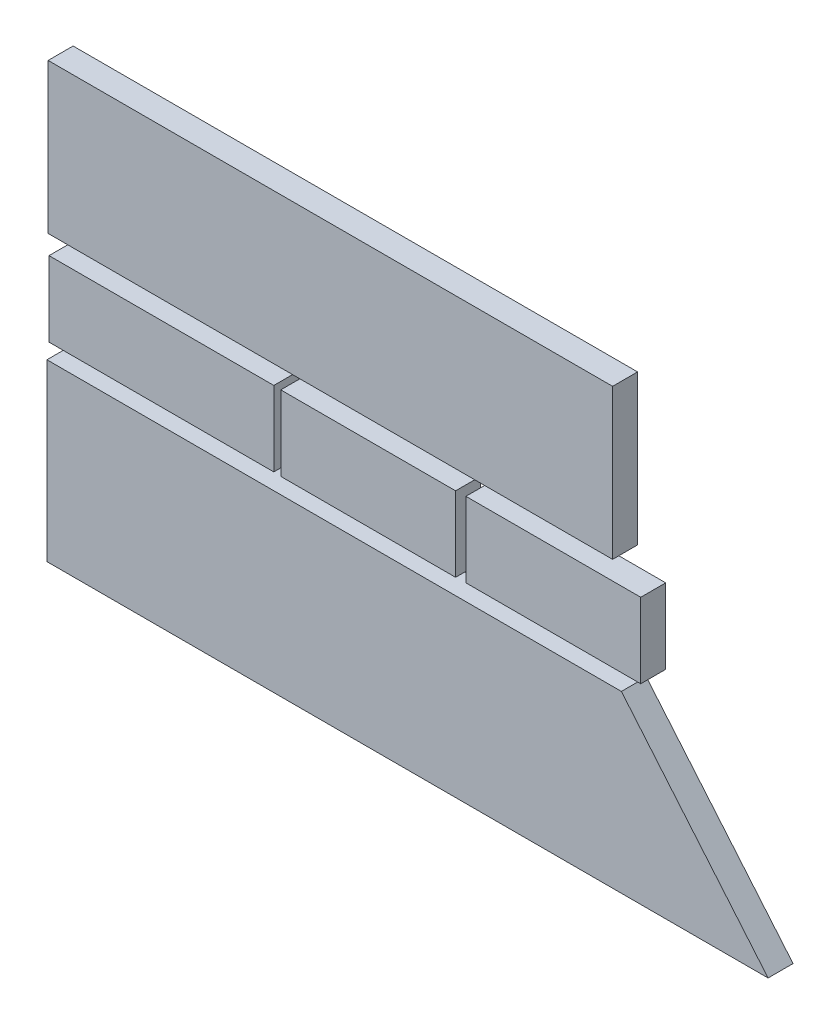
ISO-10303-21;
HEADER;
FILE_DESCRIPTION(('STEP AP214'),'2;1');
FILE_NAME('part.step','',(''),(''),'','','');
FILE_SCHEMA(('AUTOMOTIVE_DESIGN { 1 0 10303 214 1 1 1 1 }'));
ENDSEC;
DATA;
#1=APPLICATION_CONTEXT('core data for automotive mechanical design processes');
#2=APPLICATION_PROTOCOL_DEFINITION('international standard','automotive_design',2000,#1);
#3=PRODUCT_CONTEXT('',#1,'mechanical');
#4=PRODUCT('Part','Part','',(#3));
#5=PRODUCT_RELATED_PRODUCT_CATEGORY('part','',(#4));
#6=PRODUCT_DEFINITION_FORMATION('','',#4);
#7=PRODUCT_DEFINITION_CONTEXT('part definition',#1,'design');
#8=PRODUCT_DEFINITION('design','',#6,#7);
#9=PRODUCT_DEFINITION_SHAPE('','',#8);
#10=(LENGTH_UNIT() NAMED_UNIT(*) SI_UNIT(.MILLI.,.METRE.));
#11=(NAMED_UNIT(*) PLANE_ANGLE_UNIT() SI_UNIT($,.RADIAN.));
#12=(NAMED_UNIT(*) SI_UNIT($,.STERADIAN.) SOLID_ANGLE_UNIT());
#13=UNCERTAINTY_MEASURE_WITH_UNIT(LENGTH_MEASURE(1.E-05),#10,'distance_accuracy_value','');
#14=(GEOMETRIC_REPRESENTATION_CONTEXT(3) GLOBAL_UNCERTAINTY_ASSIGNED_CONTEXT((#13)) GLOBAL_UNIT_ASSIGNED_CONTEXT((#10,
#11,#12)) REPRESENTATION_CONTEXT('',''));
#15=CARTESIAN_POINT('',(0.,0.,0.));
#16=DIRECTION('',(0.,0.,1.));
#17=DIRECTION('',(1.,0.,0.));
#18=AXIS2_PLACEMENT_3D('',#15,#16,#17);
#19=CARTESIAN_POINT('',(62.189349991883,23.5474855230684,60.1976823489891));
#20=DIRECTION('',(0.,-1.,0.));
#21=DIRECTION('',(0.,0.,-1.));
#22=AXIS2_PLACEMENT_3D('',#19,#20,#21);
#23=PLANE('',#22);
#24=DIRECTION('',(-1.,0.,0.));
#25=VECTOR('',#24,1.);
#26=CARTESIAN_POINT('',(62.1893499918829,23.5474855230684,50.1976823489891));
#27=LINE('',#26,#25);
#28=CARTESIAN_POINT('',(62.1893499918829,23.5474855230684,50.1976823489891));
#29=VERTEX_POINT('',#28);
#30=CARTESIAN_POINT('',(-7.81065000811707,23.5474855230684,50.1976823489896));
#31=VERTEX_POINT('',#30);
#32=EDGE_CURVE('P0_E101',#29,#31,#27,.T.);
#33=ORIENTED_EDGE('',*,*,#32,.F.);
#34=DIRECTION('',(0.,0.,-1.));
#35=VECTOR('',#34,1.);
#36=CARTESIAN_POINT('',(62.189349991883,23.5474855230684,60.1976823489891));
#37=LINE('',#36,#35);
#38=CARTESIAN_POINT('',(62.189349991883,23.5474855230684,60.1976823489891));
#39=VERTEX_POINT('',#38);
#40=EDGE_CURVE('P0_E11',#39,#29,#37,.T.);
#41=ORIENTED_EDGE('',*,*,#40,.F.);
#42=DIRECTION('',(-1.,0.,0.));
#43=VECTOR('',#42,1.);
#44=CARTESIAN_POINT('',(62.189349991883,23.5474855230684,60.1976823489891));
#45=LINE('',#44,#43);
#46=CARTESIAN_POINT('',(-7.810650008117,23.5474855230684,60.1976823489896));
#47=VERTEX_POINT('',#46);
#48=EDGE_CURVE('P0_E95',#39,#47,#45,.T.);
#49=ORIENTED_EDGE('',*,*,#48,.T.);
#50=DIRECTION('',(0.,0.,-1.));
#51=VECTOR('',#50,1.);
#52=CARTESIAN_POINT('',(-7.810650008117,23.5474855230684,60.1976823489896));
#53=LINE('',#52,#51);
#54=EDGE_CURVE('P0_E40',#47,#31,#53,.T.);
#55=ORIENTED_EDGE('',*,*,#54,.T.);
#56=EDGE_LOOP('',(#33,#41,#49,#55));
#57=FACE_BOUND('',#56,.T.);
#58=ADVANCED_FACE('P0_F37',(#57),#23,.T.);
#59=CARTESIAN_POINT('',(62.189349991883,53.5474855230684,60.197682348989));
#60=DIRECTION('',(1.,0.,0.));
#61=DIRECTION('',(0.,0.,-1.));
#62=AXIS2_PLACEMENT_3D('',#59,#60,#61);
#63=PLANE('',#62);
#64=DIRECTION('',(0.,-1.,0.));
#65=VECTOR('',#64,1.);
#66=CARTESIAN_POINT('',(62.1893499918829,53.5474855230684,50.197682348989));
#67=LINE('',#66,#65);
#68=CARTESIAN_POINT('',(62.1893499918829,53.5474855230684,50.197682348989));
#69=VERTEX_POINT('',#68);
#70=EDGE_CURVE('P0_E97',#69,#29,#67,.T.);
#71=ORIENTED_EDGE('',*,*,#70,.F.);
#72=DIRECTION('',(0.,0.,-1.));
#73=VECTOR('',#72,1.);
#74=CARTESIAN_POINT('',(62.189349991883,53.5474855230684,60.197682348989));
#75=LINE('',#74,#73);
#76=CARTESIAN_POINT('',(62.189349991883,53.5474855230684,60.197682348989));
#77=VERTEX_POINT('',#76);
#78=EDGE_CURVE('P0_E46',#77,#69,#75,.T.);
#79=ORIENTED_EDGE('',*,*,#78,.F.);
#80=DIRECTION('',(0.,-1.,0.));
#81=VECTOR('',#80,1.);
#82=CARTESIAN_POINT('',(62.189349991883,53.5474855230684,60.197682348989));
#83=LINE('',#82,#81);
#84=EDGE_CURVE('P0_E92',#77,#39,#83,.T.);
#85=ORIENTED_EDGE('',*,*,#84,.T.);
#86=ORIENTED_EDGE('',*,*,#40,.T.);
#87=EDGE_LOOP('',(#71,#79,#85,#86));
#88=FACE_BOUND('',#87,.T.);
#89=ADVANCED_FACE('P0_F111',(#88),#63,.T.);
#90=CARTESIAN_POINT('',(-7.810650008117,53.5474855230684,60.1976823489895));
#91=DIRECTION('',(0.,1.,0.));
#92=DIRECTION('',(0.,0.,1.));
#93=AXIS2_PLACEMENT_3D('',#90,#91,#92);
#94=PLANE('',#93);
#95=DIRECTION('',(1.,0.,0.));
#96=VECTOR('',#95,1.);
#97=CARTESIAN_POINT('',(-7.81065000811707,53.5474855230684,50.1976823489895));
#98=LINE('',#97,#96);
#99=CARTESIAN_POINT('',(-7.81065000811707,53.5474855230684,50.1976823489895));
#100=VERTEX_POINT('',#99);
#101=EDGE_CURVE('P0_E87',#100,#69,#98,.T.);
#102=ORIENTED_EDGE('',*,*,#101,.F.);
#103=DIRECTION('',(0.,0.,-1.));
#104=VECTOR('',#103,1.);
#105=CARTESIAN_POINT('',(-7.810650008117,53.5474855230684,60.1976823489895));
#106=LINE('',#105,#104);
#107=CARTESIAN_POINT('',(-7.810650008117,53.5474855230684,60.1976823489895));
#108=VERTEX_POINT('',#107);
#109=EDGE_CURVE('P0_E82',#108,#100,#106,.T.);
#110=ORIENTED_EDGE('',*,*,#109,.F.);
#111=DIRECTION('',(1.,0.,0.));
#112=VECTOR('',#111,1.);
#113=CARTESIAN_POINT('',(-7.810650008117,53.5474855230684,60.1976823489895));
#114=LINE('',#113,#112);
#115=EDGE_CURVE('P0_E85',#108,#77,#114,.T.);
#116=ORIENTED_EDGE('',*,*,#115,.T.);
#117=ORIENTED_EDGE('',*,*,#78,.T.);
#118=EDGE_LOOP('',(#102,#110,#116,#117));
#119=FACE_BOUND('',#118,.T.);
#120=ADVANCED_FACE('P0_F84',(#119),#94,.T.);
#121=CARTESIAN_POINT('',(-7.810650008117,23.5474855230684,60.1976823489896));
#122=DIRECTION('',(-1.,0.,0.));
#123=DIRECTION('',(0.,0.,1.));
#124=AXIS2_PLACEMENT_3D('',#121,#122,#123);
#125=PLANE('',#124);
#126=DIRECTION('',(0.,1.,0.));
#127=VECTOR('',#126,1.);
#128=CARTESIAN_POINT('',(-7.81065000811707,23.5474855230684,50.1976823489896));
#129=LINE('',#128,#127);
#130=EDGE_CURVE('P0_E104',#31,#100,#129,.T.);
#131=ORIENTED_EDGE('',*,*,#130,.F.);
#132=ORIENTED_EDGE('',*,*,#54,.F.);
#133=DIRECTION('',(0.,1.,0.));
#134=VECTOR('',#133,1.);
#135=CARTESIAN_POINT('',(-7.810650008117,23.5474855230684,60.1976823489896));
#136=LINE('',#135,#134);
#137=EDGE_CURVE('P0_E91',#47,#108,#136,.T.);
#138=ORIENTED_EDGE('',*,*,#137,.T.);
#139=ORIENTED_EDGE('',*,*,#109,.T.);
#140=EDGE_LOOP('',(#131,#132,#138,#139));
#141=FACE_BOUND('',#140,.T.);
#142=ADVANCED_FACE('P0_F94',(#141),#125,.T.);
#143=CARTESIAN_POINT('',(4.18121664714982E-13,2.09060832357491E-13,60.1976823489896));
#144=DIRECTION('',(0.,0.,-1.));
#145=DIRECTION('',(-1.,0.,0.));
#146=AXIS2_PLACEMENT_3D('',#143,#144,#145);
#147=PLANE('',#146);
#148=ORIENTED_EDGE('',*,*,#48,.F.);
#149=ORIENTED_EDGE('',*,*,#84,.F.);
#150=ORIENTED_EDGE('',*,*,#115,.F.);
#151=ORIENTED_EDGE('',*,*,#137,.F.);
#152=EDGE_LOOP('',(#148,#149,#150,#151));
#153=FACE_BOUND('',#152,.T.);
#154=ADVANCED_FACE('P0_F90',(#153),#147,.F.);
#155=CARTESIAN_POINT('',(3.48316392041676E-13,1.74158196020838E-13,50.1976823489896));
#156=DIRECTION('',(0.,0.,-1.));
#157=DIRECTION('',(-1.,0.,0.));
#158=AXIS2_PLACEMENT_3D('',#155,#156,#157);
#159=PLANE('',#158);
#160=ORIENTED_EDGE('',*,*,#32,.T.);
#161=ORIENTED_EDGE('',*,*,#130,.T.);
#162=ORIENTED_EDGE('',*,*,#101,.T.);
#163=ORIENTED_EDGE('',*,*,#70,.T.);
#164=EDGE_LOOP('',(#160,#161,#162,#163));
#165=FACE_BOUND('',#164,.T.);
#166=ADVANCED_FACE('P0_F110',(#165),#159,.T.);
#167=CLOSED_SHELL('',(#58,#89,#120,#142,#154,#166));
#168=MANIFOLD_SOLID_BREP('P0_B2',#167);
#169=CARTESIAN_POINT('',(-101.426864066596,17.1790575138035,60.1976823480801));
#170=DIRECTION('',(0.,-1.,0.));
#171=DIRECTION('',(1.,0.,0.));
#172=AXIS2_PLACEMENT_3D('',#169,#170,#171);
#173=PLANE('',#172);
#174=DIRECTION('',(-1.,0.,0.));
#175=VECTOR('',#174,1.);
#176=CARTESIAN_POINT('',(-101.426864066596,17.1790575138035,50.1976823480801));
#177=LINE('',#176,#175);
#178=CARTESIAN_POINT('',(128.573135933404,17.1790575138035,50.1976823480801));
#179=VERTEX_POINT('',#178);
#180=CARTESIAN_POINT('',(-101.426864066596,17.1790575138035,50.1976823480801));
#181=VERTEX_POINT('',#180);
#182=EDGE_CURVE('P1_E88',#179,#181,#177,.T.);
#183=ORIENTED_EDGE('',*,*,#182,.T.);
#184=DIRECTION('',(0.,0.,-1.));
#185=VECTOR('',#184,1.);
#186=CARTESIAN_POINT('',(-101.426864066596,17.1790575138035,60.1976823480801));
#187=LINE('',#186,#185);
#188=CARTESIAN_POINT('',(-101.426864066596,17.1790575138035,60.1976823480801));
#189=VERTEX_POINT('',#188);
#190=EDGE_CURVE('P1_E12',#189,#181,#187,.T.);
#191=ORIENTED_EDGE('',*,*,#190,.F.);
#192=DIRECTION('',(-1.,0.,0.));
#193=VECTOR('',#192,1.);
#194=CARTESIAN_POINT('',(-101.426864066596,17.1790575138035,60.1976823480801));
#195=LINE('',#194,#193);
#196=CARTESIAN_POINT('',(128.573135933404,17.1790575138035,60.1976823480801));
#197=VERTEX_POINT('',#196);
#198=EDGE_CURVE('P1_E71',#197,#189,#195,.T.);
#199=ORIENTED_EDGE('',*,*,#198,.F.);
#200=DIRECTION('',(0.,0.,-1.));
#201=VECTOR('',#200,1.);
#202=CARTESIAN_POINT('',(128.573135933404,17.1790575138035,60.1976823480801));
#203=LINE('',#202,#201);
#204=EDGE_CURVE('P1_E85',#197,#179,#203,.T.);
#205=ORIENTED_EDGE('',*,*,#204,.T.);
#206=EDGE_LOOP('',(#183,#191,#199,#205));
#207=FACE_BOUND('',#206,.T.);
#208=ADVANCED_FACE('P1_F20',(#207),#173,.F.);
#209=CARTESIAN_POINT('',(-101.426864066596,-52.8209424861966,60.1976823480799));
#210=DIRECTION('',(1.,0.,0.));
#211=DIRECTION('',(0.,1.,0.));
#212=AXIS2_PLACEMENT_3D('',#209,#210,#211);
#213=PLANE('',#212);
#214=DIRECTION('',(0.,-1.,0.));
#215=VECTOR('',#214,1.);
#216=CARTESIAN_POINT('',(-101.426864066596,-52.8209424861965,50.1976823480799));
#217=LINE('',#216,#215);
#218=CARTESIAN_POINT('',(-101.426864066596,-52.8209424861965,50.1976823480799));
#219=VERTEX_POINT('',#218);
#220=EDGE_CURVE('P1_E77',#181,#219,#217,.T.);
#221=ORIENTED_EDGE('',*,*,#220,.T.);
#222=DIRECTION('',(0.,0.,-1.));
#223=VECTOR('',#222,1.);
#224=CARTESIAN_POINT('',(-101.426864066596,-52.8209424861966,60.1976823480799));
#225=LINE('',#224,#223);
#226=CARTESIAN_POINT('',(-101.426864066596,-52.8209424861966,60.1976823480799));
#227=VERTEX_POINT('',#226);
#228=EDGE_CURVE('P1_E29',#227,#219,#225,.T.);
#229=ORIENTED_EDGE('',*,*,#228,.F.);
#230=DIRECTION('',(0.,-1.,0.));
#231=VECTOR('',#230,1.);
#232=CARTESIAN_POINT('',(-101.426864066596,-52.8209424861966,60.1976823480799));
#233=LINE('',#232,#231);
#234=EDGE_CURVE('P1_E66',#189,#227,#233,.T.);
#235=ORIENTED_EDGE('',*,*,#234,.F.);
#236=ORIENTED_EDGE('',*,*,#190,.T.);
#237=EDGE_LOOP('',(#221,#229,#235,#236));
#238=FACE_BOUND('',#237,.T.);
#239=ADVANCED_FACE('P1_F76',(#238),#213,.F.);
#240=CARTESIAN_POINT('',(187.310110115814,-52.8209424861966,60.1976823480799));
#241=DIRECTION('',(0.,1.,0.));
#242=DIRECTION('',(-1.,0.,0.));
#243=AXIS2_PLACEMENT_3D('',#240,#241,#242);
#244=PLANE('',#243);
#245=DIRECTION('',(1.,0.,0.));
#246=VECTOR('',#245,1.);
#247=CARTESIAN_POINT('',(187.310110115814,-52.8209424861965,50.1976823480799));
#248=LINE('',#247,#246);
#249=CARTESIAN_POINT('',(187.310110115814,-52.8209424861965,50.1976823480799));
#250=VERTEX_POINT('',#249);
#251=EDGE_CURVE('P1_E53',#219,#250,#248,.T.);
#252=ORIENTED_EDGE('',*,*,#251,.T.);
#253=DIRECTION('',(0.,0.,-1.));
#254=VECTOR('',#253,1.);
#255=CARTESIAN_POINT('',(187.310110115814,-52.8209424861966,60.1976823480799));
#256=LINE('',#255,#254);
#257=CARTESIAN_POINT('',(187.310110115814,-52.8209424861966,60.1976823480799));
#258=VERTEX_POINT('',#257);
#259=EDGE_CURVE('P1_E79',#258,#250,#256,.T.);
#260=ORIENTED_EDGE('',*,*,#259,.F.);
#261=DIRECTION('',(1.,0.,0.));
#262=VECTOR('',#261,1.);
#263=CARTESIAN_POINT('',(-101.426864066596,-52.8209424861966,60.1976823480799));
#264=LINE('',#263,#262);
#265=EDGE_CURVE('P1_E69',#227,#258,#264,.T.);
#266=ORIENTED_EDGE('',*,*,#265,.F.);
#267=ORIENTED_EDGE('',*,*,#228,.T.);
#268=EDGE_LOOP('',(#252,#260,#266,#267));
#269=FACE_BOUND('',#268,.T.);
#270=ADVANCED_FACE('P1_F80',(#269),#244,.F.);
#271=CARTESIAN_POINT('',(128.573135933404,17.1790575138035,60.1976823480801));
#272=DIRECTION('',(-0.766044443118974,-0.642787609686544,0.));
#273=DIRECTION('',(0.642787609686544,-0.766044443118974,0.));
#274=AXIS2_PLACEMENT_3D('',#271,#272,#273);
#275=PLANE('',#274);
#276=DIRECTION('',(-0.642787609686544,0.766044443118974,0.));
#277=VECTOR('',#276,1.);
#278=CARTESIAN_POINT('',(128.573135933404,17.1790575138035,50.1976823480801));
#279=LINE('',#278,#277);
#280=EDGE_CURVE('P1_E59',#250,#179,#279,.T.);
#281=ORIENTED_EDGE('',*,*,#280,.T.);
#282=ORIENTED_EDGE('',*,*,#204,.F.);
#283=DIRECTION('',(-0.642787609686544,0.766044443118974,0.));
#284=VECTOR('',#283,1.);
#285=CARTESIAN_POINT('',(128.573135933404,17.1790575138035,60.1976823480801));
#286=LINE('',#285,#284);
#287=EDGE_CURVE('P1_E37',#258,#197,#286,.T.);
#288=ORIENTED_EDGE('',*,*,#287,.F.);
#289=ORIENTED_EDGE('',*,*,#259,.T.);
#290=EDGE_LOOP('',(#281,#282,#288,#289));
#291=FACE_BOUND('',#290,.T.);
#292=ADVANCED_FACE('P1_F107',(#291),#275,.F.);
#293=CARTESIAN_POINT('',(13.5731359334039,-17.8209424861966,60.19768234808));
#294=DIRECTION('',(0.,0.,1.));
#295=DIRECTION('',(0.,-1.,0.));
#296=AXIS2_PLACEMENT_3D('',#293,#294,#295);
#297=PLANE('',#296);
#298=ORIENTED_EDGE('',*,*,#198,.T.);
#299=ORIENTED_EDGE('',*,*,#234,.T.);
#300=ORIENTED_EDGE('',*,*,#265,.T.);
#301=ORIENTED_EDGE('',*,*,#287,.T.);
#302=EDGE_LOOP('',(#298,#299,#300,#301));
#303=FACE_BOUND('',#302,.T.);
#304=ADVANCED_FACE('P1_F67',(#303),#297,.T.);
#305=CARTESIAN_POINT('',(13.5731359334039,-17.8209424861965,50.19768234808));
#306=DIRECTION('',(0.,0.,1.));
#307=DIRECTION('',(0.,-1.,0.));
#308=AXIS2_PLACEMENT_3D('',#305,#306,#307);
#309=PLANE('',#308);
#310=ORIENTED_EDGE('',*,*,#182,.F.);
#311=ORIENTED_EDGE('',*,*,#280,.F.);
#312=ORIENTED_EDGE('',*,*,#251,.F.);
#313=ORIENTED_EDGE('',*,*,#220,.F.);
#314=EDGE_LOOP('',(#310,#311,#312,#313));
#315=FACE_BOUND('',#314,.T.);
#316=ADVANCED_FACE('P1_F110',(#315),#309,.F.);
#317=CLOSED_SHELL('',(#208,#239,#270,#292,#304,#316));
#318=MANIFOLD_SOLID_BREP('P1_B1',#317);
#319=CARTESIAN_POINT('',(136.3176936753,23.7019195724088,60.1976823480799));
#320=DIRECTION('',(-1.,0.,0.));
#321=DIRECTION('',(0.,-1.,0.));
#322=AXIS2_PLACEMENT_3D('',#319,#320,#321);
#323=PLANE('',#322);
#324=DIRECTION('',(0.,1.,0.));
#325=VECTOR('',#324,1.);
#326=CARTESIAN_POINT('',(136.3176936753,23.7019195724088,50.1976823480799));
#327=LINE('',#326,#325);
#328=CARTESIAN_POINT('',(136.3176936753,23.7019195724088,50.1976823480799));
#329=VERTEX_POINT('',#328);
#330=CARTESIAN_POINT('',(136.3176936753,53.7019195724088,50.19768234808));
#331=VERTEX_POINT('',#330);
#332=EDGE_CURVE('P2_E87',#329,#331,#327,.T.);
#333=ORIENTED_EDGE('',*,*,#332,.T.);
#334=DIRECTION('',(0.,0.,-1.));
#335=VECTOR('',#334,1.);
#336=CARTESIAN_POINT('',(136.3176936753,53.7019195724088,60.19768234808));
#337=LINE('',#336,#335);
#338=CARTESIAN_POINT('',(136.3176936753,53.7019195724088,60.19768234808));
#339=VERTEX_POINT('',#338);
#340=EDGE_CURVE('P2_E11',#339,#331,#337,.T.);
#341=ORIENTED_EDGE('',*,*,#340,.F.);
#342=DIRECTION('',(0.,1.,0.));
#343=VECTOR('',#342,1.);
#344=CARTESIAN_POINT('',(136.3176936753,23.7019195724088,60.1976823480799));
#345=LINE('',#344,#343);
#346=CARTESIAN_POINT('',(136.3176936753,23.7019195724088,60.1976823480799));
#347=VERTEX_POINT('',#346);
#348=EDGE_CURVE('P2_E71',#347,#339,#345,.T.);
#349=ORIENTED_EDGE('',*,*,#348,.F.);
#350=DIRECTION('',(0.,0.,-1.));
#351=VECTOR('',#350,1.);
#352=CARTESIAN_POINT('',(136.3176936753,23.7019195724088,60.1976823480799));
#353=LINE('',#352,#351);
#354=EDGE_CURVE('P2_E84',#347,#329,#353,.T.);
#355=ORIENTED_EDGE('',*,*,#354,.T.);
#356=EDGE_LOOP('',(#333,#341,#349,#355));
#357=FACE_BOUND('',#356,.T.);
#358=ADVANCED_FACE('P2_F19',(#357),#323,.F.);
#359=CARTESIAN_POINT('',(66.3176936752998,53.7019195724088,60.19768234808));
#360=DIRECTION('',(0.,-1.,0.));
#361=DIRECTION('',(1.,0.,0.));
#362=AXIS2_PLACEMENT_3D('',#359,#360,#361);
#363=PLANE('',#362);
#364=DIRECTION('',(-1.,0.,0.));
#365=VECTOR('',#364,1.);
#366=CARTESIAN_POINT('',(66.3176936752998,53.7019195724088,50.19768234808));
#367=LINE('',#366,#365);
#368=CARTESIAN_POINT('',(66.3176936752998,53.7019195724088,50.19768234808));
#369=VERTEX_POINT('',#368);
#370=EDGE_CURVE('P2_E76',#331,#369,#367,.T.);
#371=ORIENTED_EDGE('',*,*,#370,.T.);
#372=DIRECTION('',(0.,0.,-1.));
#373=VECTOR('',#372,1.);
#374=CARTESIAN_POINT('',(66.3176936752998,53.7019195724088,60.19768234808));
#375=LINE('',#374,#373);
#376=CARTESIAN_POINT('',(66.3176936752998,53.7019195724088,60.19768234808));
#377=VERTEX_POINT('',#376);
#378=EDGE_CURVE('P2_E28',#377,#369,#375,.T.);
#379=ORIENTED_EDGE('',*,*,#378,.F.);
#380=DIRECTION('',(-1.,0.,0.));
#381=VECTOR('',#380,1.);
#382=CARTESIAN_POINT('',(66.3176936752998,53.7019195724088,60.19768234808));
#383=LINE('',#382,#381);
#384=EDGE_CURVE('P2_E66',#339,#377,#383,.T.);
#385=ORIENTED_EDGE('',*,*,#384,.F.);
#386=ORIENTED_EDGE('',*,*,#340,.T.);
#387=EDGE_LOOP('',(#371,#379,#385,#386));
#388=FACE_BOUND('',#387,.T.);
#389=ADVANCED_FACE('P2_F75',(#388),#363,.F.);
#390=CARTESIAN_POINT('',(66.3176936752998,23.7019195724088,60.1976823480799));
#391=DIRECTION('',(1.,0.,0.));
#392=DIRECTION('',(0.,1.,0.));
#393=AXIS2_PLACEMENT_3D('',#390,#391,#392);
#394=PLANE('',#393);
#395=DIRECTION('',(0.,-1.,0.));
#396=VECTOR('',#395,1.);
#397=CARTESIAN_POINT('',(66.3176936752998,23.7019195724088,50.1976823480799));
#398=LINE('',#397,#396);
#399=CARTESIAN_POINT('',(66.3176936752998,23.7019195724088,50.1976823480799));
#400=VERTEX_POINT('',#399);
#401=EDGE_CURVE('P2_E53',#369,#400,#398,.T.);
#402=ORIENTED_EDGE('',*,*,#401,.T.);
#403=DIRECTION('',(0.,0.,-1.));
#404=VECTOR('',#403,1.);
#405=CARTESIAN_POINT('',(66.3176936752998,23.7019195724088,60.1976823480799));
#406=LINE('',#405,#404);
#407=CARTESIAN_POINT('',(66.3176936752998,23.7019195724088,60.1976823480799));
#408=VERTEX_POINT('',#407);
#409=EDGE_CURVE('P2_E78',#408,#400,#406,.T.);
#410=ORIENTED_EDGE('',*,*,#409,.F.);
#411=DIRECTION('',(0.,-1.,0.));
#412=VECTOR('',#411,1.);
#413=CARTESIAN_POINT('',(66.3176936752998,23.7019195724088,60.1976823480799));
#414=LINE('',#413,#412);
#415=EDGE_CURVE('P2_E69',#377,#408,#414,.T.);
#416=ORIENTED_EDGE('',*,*,#415,.F.);
#417=ORIENTED_EDGE('',*,*,#378,.T.);
#418=EDGE_LOOP('',(#402,#410,#416,#417));
#419=FACE_BOUND('',#418,.T.);
#420=ADVANCED_FACE('P2_F79',(#419),#394,.F.);
#421=CARTESIAN_POINT('',(66.3176936752998,23.7019195724088,60.1976823480799));
#422=DIRECTION('',(0.,1.,0.));
#423=DIRECTION('',(-1.,0.,0.));
#424=AXIS2_PLACEMENT_3D('',#421,#422,#423);
#425=PLANE('',#424);
#426=DIRECTION('',(1.,0.,0.));
#427=VECTOR('',#426,1.);
#428=CARTESIAN_POINT('',(66.3176936752998,23.7019195724088,50.1976823480799));
#429=LINE('',#428,#427);
#430=EDGE_CURVE('P2_E59',#400,#329,#429,.T.);
#431=ORIENTED_EDGE('',*,*,#430,.T.);
#432=ORIENTED_EDGE('',*,*,#354,.F.);
#433=DIRECTION('',(1.,0.,0.));
#434=VECTOR('',#433,1.);
#435=CARTESIAN_POINT('',(66.3176936752998,23.7019195724088,60.1976823480799));
#436=LINE('',#435,#434);
#437=EDGE_CURVE('P2_E36',#408,#347,#436,.T.);
#438=ORIENTED_EDGE('',*,*,#437,.F.);
#439=ORIENTED_EDGE('',*,*,#409,.T.);
#440=EDGE_LOOP('',(#431,#432,#438,#439));
#441=FACE_BOUND('',#440,.T.);
#442=ADVANCED_FACE('P2_F106',(#441),#425,.F.);
#443=CARTESIAN_POINT('',(101.3176936753,38.7019195724088,60.19768234808));
#444=DIRECTION('',(0.,0.,-1.));
#445=DIRECTION('',(0.,1.,0.));
#446=AXIS2_PLACEMENT_3D('',#443,#444,#445);
#447=PLANE('',#446);
#448=ORIENTED_EDGE('',*,*,#348,.T.);
#449=ORIENTED_EDGE('',*,*,#384,.T.);
#450=ORIENTED_EDGE('',*,*,#415,.T.);
#451=ORIENTED_EDGE('',*,*,#437,.T.);
#452=EDGE_LOOP('',(#448,#449,#450,#451));
#453=FACE_BOUND('',#452,.T.);
#454=ADVANCED_FACE('P2_F67',(#453),#447,.F.);
#455=CARTESIAN_POINT('',(101.3176936753,38.7019195724088,50.19768234808));
#456=DIRECTION('',(0.,0.,-1.));
#457=DIRECTION('',(0.,1.,0.));
#458=AXIS2_PLACEMENT_3D('',#455,#456,#457);
#459=PLANE('',#458);
#460=ORIENTED_EDGE('',*,*,#332,.F.);
#461=ORIENTED_EDGE('',*,*,#430,.F.);
#462=ORIENTED_EDGE('',*,*,#401,.F.);
#463=ORIENTED_EDGE('',*,*,#370,.F.);
#464=EDGE_LOOP('',(#460,#461,#462,#463));
#465=FACE_BOUND('',#464,.T.);
#466=ADVANCED_FACE('P2_F109',(#465),#459,.T.);
#467=CLOSED_SHELL('',(#358,#389,#420,#442,#454,#466));
#468=MANIFOLD_SOLID_BREP('P2_B1',#467);
#469=CARTESIAN_POINT('',(-10.5873004545992,23.7019195724088,60.1976823480799));
#470=DIRECTION('',(-1.,0.,0.));
#471=DIRECTION('',(0.,-1.,0.));
#472=AXIS2_PLACEMENT_3D('',#469,#470,#471);
#473=PLANE('',#472);
#474=DIRECTION('',(0.,1.,0.));
#475=VECTOR('',#474,1.);
#476=CARTESIAN_POINT('',(-10.5873004545992,23.7019195724088,50.1976823480799));
#477=LINE('',#476,#475);
#478=CARTESIAN_POINT('',(-10.5873004545992,23.7019195724088,50.1976823480799));
#479=VERTEX_POINT('',#478);
#480=CARTESIAN_POINT('',(-10.5873004545992,53.7019195724088,50.19768234808));
#481=VERTEX_POINT('',#480);
#482=EDGE_CURVE('P3_E88',#479,#481,#477,.T.);
#483=ORIENTED_EDGE('',*,*,#482,.T.);
#484=DIRECTION('',(0.,0.,-1.));
#485=VECTOR('',#484,1.);
#486=CARTESIAN_POINT('',(-10.5873004545992,53.7019195724088,60.19768234808));
#487=LINE('',#486,#485);
#488=CARTESIAN_POINT('',(-10.5873004545992,53.7019195724088,60.19768234808));
#489=VERTEX_POINT('',#488);
#490=EDGE_CURVE('P3_E12',#489,#481,#487,.T.);
#491=ORIENTED_EDGE('',*,*,#490,.F.);
#492=DIRECTION('',(0.,1.,0.));
#493=VECTOR('',#492,1.);
#494=CARTESIAN_POINT('',(-10.5873004545992,23.7019195724088,60.1976823480799));
#495=LINE('',#494,#493);
#496=CARTESIAN_POINT('',(-10.5873004545992,23.7019195724088,60.1976823480799));
#497=VERTEX_POINT('',#496);
#498=EDGE_CURVE('P3_E72',#497,#489,#495,.T.);
#499=ORIENTED_EDGE('',*,*,#498,.F.);
#500=DIRECTION('',(0.,0.,-1.));
#501=VECTOR('',#500,1.);
#502=CARTESIAN_POINT('',(-10.5873004545992,23.7019195724088,60.1976823480799));
#503=LINE('',#502,#501);
#504=EDGE_CURVE('P3_E85',#497,#479,#503,.T.);
#505=ORIENTED_EDGE('',*,*,#504,.T.);
#506=EDGE_LOOP('',(#483,#491,#499,#505));
#507=FACE_BOUND('',#506,.T.);
#508=ADVANCED_FACE('P3_F20',(#507),#473,.F.);
#509=CARTESIAN_POINT('',(-100.587300454599,53.7019195724088,60.19768234808));
#510=DIRECTION('',(0.,-1.,0.));
#511=DIRECTION('',(1.,0.,0.));
#512=AXIS2_PLACEMENT_3D('',#509,#510,#511);
#513=PLANE('',#512);
#514=DIRECTION('',(-1.,0.,0.));
#515=VECTOR('',#514,1.);
#516=CARTESIAN_POINT('',(-100.587300454599,53.7019195724088,50.19768234808));
#517=LINE('',#516,#515);
#518=CARTESIAN_POINT('',(-100.587300454599,53.7019195724088,50.19768234808));
#519=VERTEX_POINT('',#518);
#520=EDGE_CURVE('P3_E77',#481,#519,#517,.T.);
#521=ORIENTED_EDGE('',*,*,#520,.T.);
#522=DIRECTION('',(0.,0.,-1.));
#523=VECTOR('',#522,1.);
#524=CARTESIAN_POINT('',(-100.587300454599,53.7019195724088,60.19768234808));
#525=LINE('',#524,#523);
#526=CARTESIAN_POINT('',(-100.587300454599,53.7019195724088,60.19768234808));
#527=VERTEX_POINT('',#526);
#528=EDGE_CURVE('P3_E29',#527,#519,#525,.T.);
#529=ORIENTED_EDGE('',*,*,#528,.F.);
#530=DIRECTION('',(-1.,0.,0.));
#531=VECTOR('',#530,1.);
#532=CARTESIAN_POINT('',(-100.587300454599,53.7019195724088,60.19768234808));
#533=LINE('',#532,#531);
#534=EDGE_CURVE('P3_E67',#489,#527,#533,.T.);
#535=ORIENTED_EDGE('',*,*,#534,.F.);
#536=ORIENTED_EDGE('',*,*,#490,.T.);
#537=EDGE_LOOP('',(#521,#529,#535,#536));
#538=FACE_BOUND('',#537,.T.);
#539=ADVANCED_FACE('P3_F76',(#538),#513,.F.);
#540=CARTESIAN_POINT('',(-100.587300454599,23.7019195724088,60.1976823480799));
#541=DIRECTION('',(1.,0.,0.));
#542=DIRECTION('',(0.,1.,0.));
#543=AXIS2_PLACEMENT_3D('',#540,#541,#542);
#544=PLANE('',#543);
#545=DIRECTION('',(0.,-1.,0.));
#546=VECTOR('',#545,1.);
#547=CARTESIAN_POINT('',(-100.587300454599,23.7019195724088,50.1976823480799));
#548=LINE('',#547,#546);
#549=CARTESIAN_POINT('',(-100.587300454599,23.7019195724088,50.1976823480799));
#550=VERTEX_POINT('',#549);
#551=EDGE_CURVE('P3_E54',#519,#550,#548,.T.);
#552=ORIENTED_EDGE('',*,*,#551,.T.);
#553=DIRECTION('',(0.,0.,-1.));
#554=VECTOR('',#553,1.);
#555=CARTESIAN_POINT('',(-100.587300454599,23.7019195724088,60.1976823480799));
#556=LINE('',#555,#554);
#557=CARTESIAN_POINT('',(-100.587300454599,23.7019195724088,60.1976823480799));
#558=VERTEX_POINT('',#557);
#559=EDGE_CURVE('P3_E79',#558,#550,#556,.T.);
#560=ORIENTED_EDGE('',*,*,#559,.F.);
#561=DIRECTION('',(0.,-1.,0.));
#562=VECTOR('',#561,1.);
#563=CARTESIAN_POINT('',(-100.587300454599,23.7019195724088,60.1976823480799));
#564=LINE('',#563,#562);
#565=EDGE_CURVE('P3_E70',#527,#558,#564,.T.);
#566=ORIENTED_EDGE('',*,*,#565,.F.);
#567=ORIENTED_EDGE('',*,*,#528,.T.);
#568=EDGE_LOOP('',(#552,#560,#566,#567));
#569=FACE_BOUND('',#568,.T.);
#570=ADVANCED_FACE('P3_F80',(#569),#544,.F.);
#571=CARTESIAN_POINT('',(-100.587300454599,23.7019195724088,60.1976823480799));
#572=DIRECTION('',(0.,1.,0.));
#573=DIRECTION('',(-1.,0.,0.));
#574=AXIS2_PLACEMENT_3D('',#571,#572,#573);
#575=PLANE('',#574);
#576=DIRECTION('',(1.,0.,0.));
#577=VECTOR('',#576,1.);
#578=CARTESIAN_POINT('',(-100.587300454599,23.7019195724088,50.1976823480799));
#579=LINE('',#578,#577);
#580=EDGE_CURVE('P3_E60',#550,#479,#579,.T.);
#581=ORIENTED_EDGE('',*,*,#580,.T.);
#582=ORIENTED_EDGE('',*,*,#504,.F.);
#583=DIRECTION('',(1.,0.,0.));
#584=VECTOR('',#583,1.);
#585=CARTESIAN_POINT('',(-100.587300454599,23.7019195724088,60.1976823480799));
#586=LINE('',#585,#584);
#587=EDGE_CURVE('P3_E37',#558,#497,#586,.T.);
#588=ORIENTED_EDGE('',*,*,#587,.F.);
#589=ORIENTED_EDGE('',*,*,#559,.T.);
#590=EDGE_LOOP('',(#581,#582,#588,#589));
#591=FACE_BOUND('',#590,.T.);
#592=ADVANCED_FACE('P3_F107',(#591),#575,.F.);
#593=CARTESIAN_POINT('',(-55.5873004545992,38.7019195724088,60.19768234808));
#594=DIRECTION('',(0.,0.,-1.));
#595=DIRECTION('',(0.,1.,0.));
#596=AXIS2_PLACEMENT_3D('',#593,#594,#595);
#597=PLANE('',#596);
#598=ORIENTED_EDGE('',*,*,#498,.T.);
#599=ORIENTED_EDGE('',*,*,#534,.T.);
#600=ORIENTED_EDGE('',*,*,#565,.T.);
#601=ORIENTED_EDGE('',*,*,#587,.T.);
#602=EDGE_LOOP('',(#598,#599,#600,#601));
#603=FACE_BOUND('',#602,.T.);
#604=ADVANCED_FACE('P3_F68',(#603),#597,.F.);
#605=CARTESIAN_POINT('',(-55.5873004545992,38.7019195724088,50.19768234808));
#606=DIRECTION('',(0.,0.,-1.));
#607=DIRECTION('',(0.,1.,0.));
#608=AXIS2_PLACEMENT_3D('',#605,#606,#607);
#609=PLANE('',#608);
#610=ORIENTED_EDGE('',*,*,#482,.F.);
#611=ORIENTED_EDGE('',*,*,#580,.F.);
#612=ORIENTED_EDGE('',*,*,#551,.F.);
#613=ORIENTED_EDGE('',*,*,#520,.F.);
#614=EDGE_LOOP('',(#610,#611,#612,#613));
#615=FACE_BOUND('',#614,.T.);
#616=ADVANCED_FACE('P3_F110',(#615),#609,.T.);
#617=CLOSED_SHELL('',(#508,#539,#570,#592,#604,#616));
#618=MANIFOLD_SOLID_BREP('P3_B1',#617);
#619=CARTESIAN_POINT('',(125.054813156519,61.2094963481624,60.1976823480799));
#620=DIRECTION('',(-1.,0.,0.));
#621=DIRECTION('',(0.,-1.,0.));
#622=AXIS2_PLACEMENT_3D('',#619,#620,#621);
#623=PLANE('',#622);
#624=DIRECTION('',(0.,1.,0.));
#625=VECTOR('',#624,1.);
#626=CARTESIAN_POINT('',(125.054813156519,61.2094963481624,50.1976823480799));
#627=LINE('',#626,#625);
#628=CARTESIAN_POINT('',(125.054813156519,61.2094963481624,50.1976823480799));
#629=VERTEX_POINT('',#628);
#630=CARTESIAN_POINT('',(125.054813156519,121.209496348162,50.1976823480801));
#631=VERTEX_POINT('',#630);
#632=EDGE_CURVE('P4_E88',#629,#631,#627,.T.);
#633=ORIENTED_EDGE('',*,*,#632,.T.);
#634=DIRECTION('',(0.,0.,-1.));
#635=VECTOR('',#634,1.);
#636=CARTESIAN_POINT('',(125.054813156519,121.209496348162,60.1976823480801));
#637=LINE('',#636,#635);
#638=CARTESIAN_POINT('',(125.054813156519,121.209496348162,60.1976823480801));
#639=VERTEX_POINT('',#638);
#640=EDGE_CURVE('P4_E12',#639,#631,#637,.T.);
#641=ORIENTED_EDGE('',*,*,#640,.F.);
#642=DIRECTION('',(0.,1.,0.));
#643=VECTOR('',#642,1.);
#644=CARTESIAN_POINT('',(125.054813156519,61.2094963481624,60.1976823480799));
#645=LINE('',#644,#643);
#646=CARTESIAN_POINT('',(125.054813156519,61.2094963481624,60.1976823480799));
#647=VERTEX_POINT('',#646);
#648=EDGE_CURVE('P4_E72',#647,#639,#645,.T.);
#649=ORIENTED_EDGE('',*,*,#648,.F.);
#650=DIRECTION('',(0.,0.,-1.));
#651=VECTOR('',#650,1.);
#652=CARTESIAN_POINT('',(125.054813156519,61.2094963481624,60.1976823480799));
#653=LINE('',#652,#651);
#654=EDGE_CURVE('P4_E85',#647,#629,#653,.T.);
#655=ORIENTED_EDGE('',*,*,#654,.T.);
#656=EDGE_LOOP('',(#633,#641,#649,#655));
#657=FACE_BOUND('',#656,.T.);
#658=ADVANCED_FACE('P4_F20',(#657),#623,.F.);
#659=CARTESIAN_POINT('',(-100.945186843481,121.209496348162,60.1976823480801));
#660=DIRECTION('',(0.,-1.,0.));
#661=DIRECTION('',(1.,0.,0.));
#662=AXIS2_PLACEMENT_3D('',#659,#660,#661);
#663=PLANE('',#662);
#664=DIRECTION('',(-1.,0.,0.));
#665=VECTOR('',#664,1.);
#666=CARTESIAN_POINT('',(-100.945186843481,121.209496348162,50.1976823480801));
#667=LINE('',#666,#665);
#668=CARTESIAN_POINT('',(-100.945186843481,121.209496348162,50.1976823480801));
#669=VERTEX_POINT('',#668);
#670=EDGE_CURVE('P4_E77',#631,#669,#667,.T.);
#671=ORIENTED_EDGE('',*,*,#670,.T.);
#672=DIRECTION('',(0.,0.,-1.));
#673=VECTOR('',#672,1.);
#674=CARTESIAN_POINT('',(-100.945186843481,121.209496348162,60.1976823480801));
#675=LINE('',#674,#673);
#676=CARTESIAN_POINT('',(-100.945186843481,121.209496348162,60.1976823480801));
#677=VERTEX_POINT('',#676);
#678=EDGE_CURVE('P4_E29',#677,#669,#675,.T.);
#679=ORIENTED_EDGE('',*,*,#678,.F.);
#680=DIRECTION('',(-1.,0.,0.));
#681=VECTOR('',#680,1.);
#682=CARTESIAN_POINT('',(-100.945186843481,121.209496348162,60.1976823480801));
#683=LINE('',#682,#681);
#684=EDGE_CURVE('P4_E67',#639,#677,#683,.T.);
#685=ORIENTED_EDGE('',*,*,#684,.F.);
#686=ORIENTED_EDGE('',*,*,#640,.T.);
#687=EDGE_LOOP('',(#671,#679,#685,#686));
#688=FACE_BOUND('',#687,.T.);
#689=ADVANCED_FACE('P4_F76',(#688),#663,.F.);
#690=CARTESIAN_POINT('',(-100.945186843481,61.2094963481624,60.1976823480799));
#691=DIRECTION('',(1.,0.,0.));
#692=DIRECTION('',(0.,1.,0.));
#693=AXIS2_PLACEMENT_3D('',#690,#691,#692);
#694=PLANE('',#693);
#695=DIRECTION('',(0.,-1.,0.));
#696=VECTOR('',#695,1.);
#697=CARTESIAN_POINT('',(-100.945186843481,61.2094963481624,50.1976823480799));
#698=LINE('',#697,#696);
#699=CARTESIAN_POINT('',(-100.945186843481,61.2094963481624,50.1976823480799));
#700=VERTEX_POINT('',#699);
#701=EDGE_CURVE('P4_E54',#669,#700,#698,.T.);
#702=ORIENTED_EDGE('',*,*,#701,.T.);
#703=DIRECTION('',(0.,0.,-1.));
#704=VECTOR('',#703,1.);
#705=CARTESIAN_POINT('',(-100.945186843481,61.2094963481624,60.1976823480799));
#706=LINE('',#705,#704);
#707=CARTESIAN_POINT('',(-100.945186843481,61.2094963481624,60.1976823480799));
#708=VERTEX_POINT('',#707);
#709=EDGE_CURVE('P4_E79',#708,#700,#706,.T.);
#710=ORIENTED_EDGE('',*,*,#709,.F.);
#711=DIRECTION('',(0.,-1.,0.));
#712=VECTOR('',#711,1.);
#713=CARTESIAN_POINT('',(-100.945186843481,61.2094963481624,60.1976823480799));
#714=LINE('',#713,#712);
#715=EDGE_CURVE('P4_E70',#677,#708,#714,.T.);
#716=ORIENTED_EDGE('',*,*,#715,.F.);
#717=ORIENTED_EDGE('',*,*,#678,.T.);
#718=EDGE_LOOP('',(#702,#710,#716,#717));
#719=FACE_BOUND('',#718,.T.);
#720=ADVANCED_FACE('P4_F80',(#719),#694,.F.);
#721=CARTESIAN_POINT('',(-100.945186843481,61.2094963481624,60.1976823480799));
#722=DIRECTION('',(0.,1.,0.));
#723=DIRECTION('',(-1.,0.,0.));
#724=AXIS2_PLACEMENT_3D('',#721,#722,#723);
#725=PLANE('',#724);
#726=DIRECTION('',(1.,0.,0.));
#727=VECTOR('',#726,1.);
#728=CARTESIAN_POINT('',(-100.945186843481,61.2094963481624,50.1976823480799));
#729=LINE('',#728,#727);
#730=EDGE_CURVE('P4_E60',#700,#629,#729,.T.);
#731=ORIENTED_EDGE('',*,*,#730,.T.);
#732=ORIENTED_EDGE('',*,*,#654,.F.);
#733=DIRECTION('',(1.,0.,0.));
#734=VECTOR('',#733,1.);
#735=CARTESIAN_POINT('',(-100.945186843481,61.2094963481624,60.1976823480799));
#736=LINE('',#735,#734);
#737=EDGE_CURVE('P4_E37',#708,#647,#736,.T.);
#738=ORIENTED_EDGE('',*,*,#737,.F.);
#739=ORIENTED_EDGE('',*,*,#709,.T.);
#740=EDGE_LOOP('',(#731,#732,#738,#739));
#741=FACE_BOUND('',#740,.T.);
#742=ADVANCED_FACE('P4_F107',(#741),#725,.F.);
#743=CARTESIAN_POINT('',(12.0548131565187,91.2094963481624,60.19768234808));
#744=DIRECTION('',(0.,0.,-1.));
#745=DIRECTION('',(0.,1.,0.));
#746=AXIS2_PLACEMENT_3D('',#743,#744,#745);
#747=PLANE('',#746);
#748=ORIENTED_EDGE('',*,*,#648,.T.);
#749=ORIENTED_EDGE('',*,*,#684,.T.);
#750=ORIENTED_EDGE('',*,*,#715,.T.);
#751=ORIENTED_EDGE('',*,*,#737,.T.);
#752=EDGE_LOOP('',(#748,#749,#750,#751));
#753=FACE_BOUND('',#752,.T.);
#754=ADVANCED_FACE('P4_F68',(#753),#747,.F.);
#755=CARTESIAN_POINT('',(12.0548131565187,91.2094963481624,50.19768234808));
#756=DIRECTION('',(0.,0.,-1.));
#757=DIRECTION('',(0.,1.,0.));
#758=AXIS2_PLACEMENT_3D('',#755,#756,#757);
#759=PLANE('',#758);
#760=ORIENTED_EDGE('',*,*,#632,.F.);
#761=ORIENTED_EDGE('',*,*,#730,.F.);
#762=ORIENTED_EDGE('',*,*,#701,.F.);
#763=ORIENTED_EDGE('',*,*,#670,.F.);
#764=EDGE_LOOP('',(#760,#761,#762,#763));
#765=FACE_BOUND('',#764,.T.);
#766=ADVANCED_FACE('P4_F110',(#765),#759,.T.);
#767=CLOSED_SHELL('',(#658,#689,#720,#742,#754,#766));
#768=MANIFOLD_SOLID_BREP('P4_B1',#767);
#769=ADVANCED_BREP_SHAPE_REPRESENTATION('',(#18,#168,#318,#468,#618,#768),#14);
#770=SHAPE_DEFINITION_REPRESENTATION(#9,#769);
ENDSEC;
END-ISO-10303-21;
